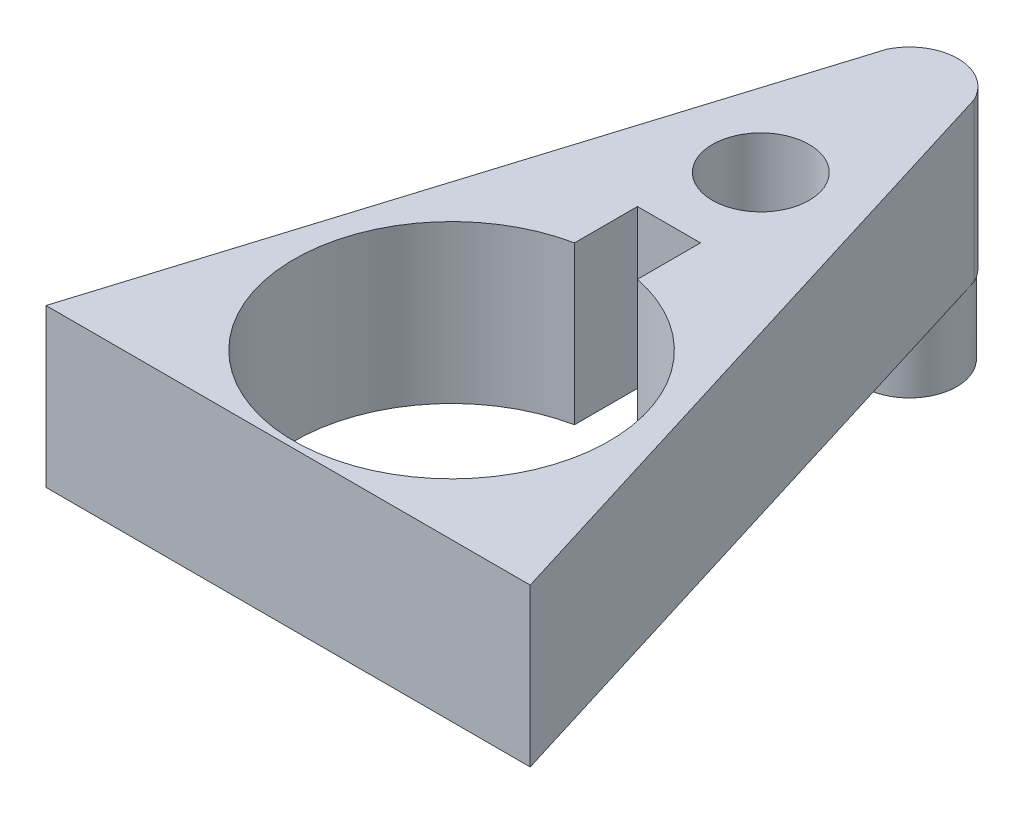
ISO-10303-21;
HEADER;
FILE_DESCRIPTION(('STEP AP214'),'2;1');
FILE_NAME('part.step','',(''),(''),'','','');
FILE_SCHEMA(('AUTOMOTIVE_DESIGN { 1 0 10303 214 1 1 1 1 }'));
ENDSEC;
DATA;
#1=APPLICATION_CONTEXT('core data for automotive mechanical design processes');
#2=APPLICATION_PROTOCOL_DEFINITION('international standard','automotive_design',2000,#1);
#3=PRODUCT_CONTEXT('',#1,'mechanical');
#4=PRODUCT('Part','Part','',(#3));
#5=PRODUCT_RELATED_PRODUCT_CATEGORY('part','',(#4));
#6=PRODUCT_DEFINITION_FORMATION('','',#4);
#7=PRODUCT_DEFINITION_CONTEXT('part definition',#1,'design');
#8=PRODUCT_DEFINITION('design','',#6,#7);
#9=PRODUCT_DEFINITION_SHAPE('','',#8);
#10=(LENGTH_UNIT() NAMED_UNIT(*) SI_UNIT(.MILLI.,.METRE.));
#11=(NAMED_UNIT(*) PLANE_ANGLE_UNIT() SI_UNIT($,.RADIAN.));
#12=(NAMED_UNIT(*) SI_UNIT($,.STERADIAN.) SOLID_ANGLE_UNIT());
#13=UNCERTAINTY_MEASURE_WITH_UNIT(LENGTH_MEASURE(1.E-05),#10,'distance_accuracy_value','');
#14=(GEOMETRIC_REPRESENTATION_CONTEXT(3) GLOBAL_UNCERTAINTY_ASSIGNED_CONTEXT((#13)) GLOBAL_UNIT_ASSIGNED_CONTEXT((#10,
#11,#12)) REPRESENTATION_CONTEXT('',''));
#15=CARTESIAN_POINT('',(0.,0.,0.));
#16=DIRECTION('',(0.,0.,1.));
#17=DIRECTION('',(1.,0.,0.));
#18=AXIS2_PLACEMENT_3D('',#15,#16,#17);
#19=CARTESIAN_POINT('',(15.3666140099526,0.,-39.4399641466912));
#20=DIRECTION('',(0.,1.,0.));
#21=DIRECTION('',(0.,0.,1.));
#22=AXIS2_PLACEMENT_3D('',#19,#20,#21);
#23=PLANE('',#22);
#24=DIRECTION('',(0.,0.,1.));
#25=VECTOR('',#24,1.);
#26=CARTESIAN_POINT('',(13.3271004224125,0.,-20.2120417496787));
#27=LINE('',#26,#25);
#28=CARTESIAN_POINT('',(13.3271004224125,0.,-24.2120417496787));
#29=VERTEX_POINT('',#28);
#30=CARTESIAN_POINT('',(13.3271004224125,0.,-20.2120417496787));
#31=VERTEX_POINT('',#30);
#32=EDGE_CURVE('E108',#29,#31,#27,.T.);
#33=ORIENTED_EDGE('',*,*,#32,.T.);
#34=CARTESIAN_POINT('',(15.3271004224125,0.,-10.414082778546));
#35=DIRECTION('',(0.,1.,0.));
#36=DIRECTION('',(0.,0.,1.));
#37=AXIS2_PLACEMENT_3D('',#34,#35,#36);
#38=CIRCLE('',#37,10.);
#39=CARTESIAN_POINT('',(17.3271004224125,0.,-20.2120417496787));
#40=VERTEX_POINT('',#39);
#41=EDGE_CURVE('E102',#31,#40,#38,.T.);
#42=ORIENTED_EDGE('',*,*,#41,.T.);
#43=DIRECTION('',(0.,0.,-1.));
#44=VECTOR('',#43,1.);
#45=CARTESIAN_POINT('',(17.3271004224125,0.,-20.2120417496787));
#46=LINE('',#45,#44);
#47=CARTESIAN_POINT('',(17.3271004224125,0.,-24.2120417496787));
#48=VERTEX_POINT('',#47);
#49=EDGE_CURVE('E111',#40,#48,#46,.T.);
#50=ORIENTED_EDGE('',*,*,#49,.T.);
#51=DIRECTION('',(-1.,0.,0.));
#52=VECTOR('',#51,1.);
#53=CARTESIAN_POINT('',(13.3271004224125,0.,-24.2120417496787));
#54=LINE('',#53,#52);
#55=EDGE_CURVE('E50',#48,#29,#54,.T.);
#56=ORIENTED_EDGE('',*,*,#55,.T.);
#57=EDGE_LOOP('',(#33,#42,#50,#56));
#58=FACE_BOUND('',#57,.T.);
#59=CARTESIAN_POINT('',(15.3666140099526,0.,-30.));
#60=DIRECTION('',(0.,1.,0.));
#61=DIRECTION('',(0.,0.,1.));
#62=AXIS2_PLACEMENT_3D('',#59,#60,#61);
#63=CIRCLE('',#62,3.07332280199052);
#64=CARTESIAN_POINT('',(15.3666140099526,0.,-26.9266771980095));
#65=VERTEX_POINT('',#64);
#66=EDGE_CURVE('E138',#65,#65,#63,.T.);
#67=ORIENTED_EDGE('',*,*,#66,.T.);
#68=EDGE_LOOP('',(#67));
#69=FACE_BOUND('',#68,.T.);
#70=DIRECTION('',(-0.29515149415526,0.,0.95545046731786));
#71=VECTOR('',#70,1.);
#72=CARTESIAN_POINT('',(0.,0.,0.));
#73=LINE('',#72,#71);
#74=CARTESIAN_POINT('',(12.5914844165515,0.,-40.7605582497616));
#75=VERTEX_POINT('',#74);
#76=CARTESIAN_POINT('',(0.,0.,0.));
#77=VERTEX_POINT('',#76);
#78=EDGE_CURVE('E142',#75,#77,#73,.T.);
#79=ORIENTED_EDGE('',*,*,#78,.F.);
#80=CARTESIAN_POINT('',(15.3666140099526,0.,-39.4399641466912));
#81=DIRECTION('',(0.,1.,0.));
#82=DIRECTION('',(0.,0.,1.));
#83=AXIS2_PLACEMENT_3D('',#80,#81,#82);
#84=CIRCLE('',#83,3.07332280199052);
#85=CARTESIAN_POINT('',(18.1417436033537,0.,-40.7605582497616));
#86=VERTEX_POINT('',#85);
#87=EDGE_CURVE('E149',#86,#75,#84,.T.);
#88=ORIENTED_EDGE('',*,*,#87,.F.);
#89=DIRECTION('',(-0.29515149415526,0.,-0.95545046731786));
#90=VECTOR('',#89,1.);
#91=CARTESIAN_POINT('',(30.7332280199051,0.,0.));
#92=LINE('',#91,#90);
#93=CARTESIAN_POINT('',(30.7332280199051,0.,0.));
#94=VERTEX_POINT('',#93);
#95=EDGE_CURVE('E160',#94,#86,#92,.T.);
#96=ORIENTED_EDGE('',*,*,#95,.F.);
#97=DIRECTION('',(1.,0.,0.));
#98=VECTOR('',#97,1.);
#99=CARTESIAN_POINT('',(0.,0.,0.));
#100=LINE('',#99,#98);
#101=EDGE_CURVE('E158',#77,#94,#100,.T.);
#102=ORIENTED_EDGE('',*,*,#101,.F.);
#103=EDGE_LOOP('',(#79,#88,#96,#102));
#104=FACE_BOUND('',#103,.T.);
#105=CARTESIAN_POINT('',(15.3666140099526,0.,-39.4399641466912));
#106=DIRECTION('',(0.,1.,0.));
#107=DIRECTION('',(0.,0.,1.));
#108=AXIS2_PLACEMENT_3D('',#105,#106,#107);
#109=CIRCLE('',#108,3.);
#110=CARTESIAN_POINT('',(15.3666140099526,0.,-36.4399641466912));
#111=VERTEX_POINT('',#110);
#112=EDGE_CURVE('E11',#111,#111,#109,.F.);
#113=ORIENTED_EDGE('',*,*,#112,.F.);
#114=EDGE_LOOP('',(#113));
#115=FACE_BOUND('',#114,.T.);
#116=ADVANCED_FACE('F35',(#58,#69,#104,#115),#23,.F.);
#117=CARTESIAN_POINT('',(15.3666140099526,10.,-39.4399641466912));
#118=DIRECTION('',(0.,1.,0.));
#119=DIRECTION('',(0.,0.,1.));
#120=AXIS2_PLACEMENT_3D('',#117,#118,#119);
#121=PLANE('',#120);
#122=CARTESIAN_POINT('',(15.3271004224125,10.,-10.414082778546));
#123=DIRECTION('',(0.,1.,0.));
#124=DIRECTION('',(0.,0.,1.));
#125=AXIS2_PLACEMENT_3D('',#122,#123,#124);
#126=CIRCLE('',#125,10.);
#127=CARTESIAN_POINT('',(13.3271004224125,10.,-20.2120417496787));
#128=VERTEX_POINT('',#127);
#129=CARTESIAN_POINT('',(17.3271004224125,10.,-20.2120417496787));
#130=VERTEX_POINT('',#129);
#131=EDGE_CURVE('E58',#128,#130,#126,.T.);
#132=ORIENTED_EDGE('',*,*,#131,.F.);
#133=DIRECTION('',(0.,0.,1.));
#134=VECTOR('',#133,1.);
#135=CARTESIAN_POINT('',(13.3271004224125,10.,-20.2120417496787));
#136=LINE('',#135,#134);
#137=CARTESIAN_POINT('',(13.3271004224125,10.,-24.2120417496787));
#138=VERTEX_POINT('',#137);
#139=EDGE_CURVE('E117',#138,#128,#136,.T.);
#140=ORIENTED_EDGE('',*,*,#139,.F.);
#141=DIRECTION('',(-1.,0.,0.));
#142=VECTOR('',#141,1.);
#143=CARTESIAN_POINT('',(13.3271004224125,10.,-24.2120417496787));
#144=LINE('',#143,#142);
#145=CARTESIAN_POINT('',(17.3271004224125,10.,-24.2120417496787));
#146=VERTEX_POINT('',#145);
#147=EDGE_CURVE('E120',#146,#138,#144,.T.);
#148=ORIENTED_EDGE('',*,*,#147,.F.);
#149=DIRECTION('',(0.,0.,-1.));
#150=VECTOR('',#149,1.);
#151=CARTESIAN_POINT('',(17.3271004224125,10.,-20.2120417496787));
#152=LINE('',#151,#150);
#153=EDGE_CURVE('E126',#130,#146,#152,.T.);
#154=ORIENTED_EDGE('',*,*,#153,.F.);
#155=EDGE_LOOP('',(#132,#140,#148,#154));
#156=FACE_BOUND('',#155,.T.);
#157=DIRECTION('',(-0.29515149415526,0.,0.95545046731786));
#158=VECTOR('',#157,1.);
#159=CARTESIAN_POINT('',(0.,10.,0.));
#160=LINE('',#159,#158);
#161=CARTESIAN_POINT('',(12.5914844165515,10.,-40.7605582497616));
#162=VERTEX_POINT('',#161);
#163=CARTESIAN_POINT('',(0.,10.,0.));
#164=VERTEX_POINT('',#163);
#165=EDGE_CURVE('E145',#162,#164,#160,.T.);
#166=ORIENTED_EDGE('',*,*,#165,.T.);
#167=DIRECTION('',(1.,0.,0.));
#168=VECTOR('',#167,1.);
#169=CARTESIAN_POINT('',(0.,10.,0.));
#170=LINE('',#169,#168);
#171=CARTESIAN_POINT('',(30.7332280199051,10.,0.));
#172=VERTEX_POINT('',#171);
#173=EDGE_CURVE('E148',#164,#172,#170,.T.);
#174=ORIENTED_EDGE('',*,*,#173,.T.);
#175=DIRECTION('',(-0.29515149415526,0.,-0.95545046731786));
#176=VECTOR('',#175,1.);
#177=CARTESIAN_POINT('',(30.7332280199051,10.,0.));
#178=LINE('',#177,#176);
#179=CARTESIAN_POINT('',(18.1417436033537,10.,-40.7605582497616));
#180=VERTEX_POINT('',#179);
#181=EDGE_CURVE('E151',#172,#180,#178,.T.);
#182=ORIENTED_EDGE('',*,*,#181,.T.);
#183=CARTESIAN_POINT('',(15.3666140099526,10.,-39.4399641466912));
#184=DIRECTION('',(0.,1.,0.));
#185=DIRECTION('',(0.,0.,1.));
#186=AXIS2_PLACEMENT_3D('',#183,#184,#185);
#187=CIRCLE('',#186,3.07332280199052);
#188=EDGE_CURVE('E153',#180,#162,#187,.T.);
#189=ORIENTED_EDGE('',*,*,#188,.T.);
#190=EDGE_LOOP('',(#166,#174,#182,#189));
#191=FACE_BOUND('',#190,.T.);
#192=CARTESIAN_POINT('',(15.3666140099526,10.,-30.));
#193=DIRECTION('',(0.,1.,0.));
#194=DIRECTION('',(0.,0.,1.));
#195=AXIS2_PLACEMENT_3D('',#192,#193,#194);
#196=CIRCLE('',#195,3.07332280199052);
#197=CARTESIAN_POINT('',(15.3666140099526,10.,-26.9266771980095));
#198=VERTEX_POINT('',#197);
#199=EDGE_CURVE('E139',#198,#198,#196,.T.);
#200=ORIENTED_EDGE('',*,*,#199,.F.);
#201=EDGE_LOOP('',(#200));
#202=FACE_BOUND('',#201,.T.);
#203=ADVANCED_FACE('F191',(#156,#191,#202),#121,.T.);
#204=CARTESIAN_POINT('',(0.,10.,0.));
#205=DIRECTION('',(0.95545046731786,0.,0.29515149415526));
#206=DIRECTION('',(0.29515149415526,0.,-0.95545046731786));
#207=AXIS2_PLACEMENT_3D('',#204,#205,#206);
#208=PLANE('',#207);
#209=ORIENTED_EDGE('',*,*,#78,.T.);
#210=DIRECTION('',(0.,-1.,0.));
#211=VECTOR('',#210,1.);
#212=CARTESIAN_POINT('',(0.,10.,0.));
#213=LINE('',#212,#211);
#214=EDGE_CURVE('E43',#164,#77,#213,.T.);
#215=ORIENTED_EDGE('',*,*,#214,.F.);
#216=ORIENTED_EDGE('',*,*,#165,.F.);
#217=DIRECTION('',(0.,-1.,0.));
#218=VECTOR('',#217,1.);
#219=CARTESIAN_POINT('',(12.5914844165515,10.,-40.7605582497616));
#220=LINE('',#219,#218);
#221=EDGE_CURVE('E155',#162,#75,#220,.T.);
#222=ORIENTED_EDGE('',*,*,#221,.T.);
#223=EDGE_LOOP('',(#209,#215,#216,#222));
#224=FACE_BOUND('',#223,.T.);
#225=ADVANCED_FACE('F37',(#224),#208,.F.);
#226=CARTESIAN_POINT('',(0.,10.,0.));
#227=DIRECTION('',(0.,0.,-1.));
#228=DIRECTION('',(-1.,0.,0.));
#229=AXIS2_PLACEMENT_3D('',#226,#227,#228);
#230=PLANE('',#229);
#231=ORIENTED_EDGE('',*,*,#101,.T.);
#232=DIRECTION('',(0.,-1.,0.));
#233=VECTOR('',#232,1.);
#234=CARTESIAN_POINT('',(30.7332280199051,10.,0.));
#235=LINE('',#234,#233);
#236=EDGE_CURVE('E168',#172,#94,#235,.T.);
#237=ORIENTED_EDGE('',*,*,#236,.F.);
#238=ORIENTED_EDGE('',*,*,#173,.F.);
#239=ORIENTED_EDGE('',*,*,#214,.T.);
#240=EDGE_LOOP('',(#231,#237,#238,#239));
#241=FACE_BOUND('',#240,.T.);
#242=ADVANCED_FACE('F173',(#241),#230,.F.);
#243=CARTESIAN_POINT('',(30.7332280199051,10.,0.));
#244=DIRECTION('',(-0.95545046731786,0.,0.29515149415526));
#245=DIRECTION('',(0.29515149415526,0.,0.95545046731786));
#246=AXIS2_PLACEMENT_3D('',#243,#244,#245);
#247=PLANE('',#246);
#248=ORIENTED_EDGE('',*,*,#95,.T.);
#249=DIRECTION('',(0.,-1.,0.));
#250=VECTOR('',#249,1.);
#251=CARTESIAN_POINT('',(18.1417436033537,10.,-40.7605582497616));
#252=LINE('',#251,#250);
#253=EDGE_CURVE('E165',#180,#86,#252,.T.);
#254=ORIENTED_EDGE('',*,*,#253,.F.);
#255=ORIENTED_EDGE('',*,*,#181,.F.);
#256=ORIENTED_EDGE('',*,*,#236,.T.);
#257=EDGE_LOOP('',(#248,#254,#255,#256));
#258=FACE_BOUND('',#257,.T.);
#259=ADVANCED_FACE('F185',(#258),#247,.F.);
#260=CARTESIAN_POINT('',(15.3666140099526,10.,-39.4399641466912));
#261=DIRECTION('',(0.,-1.,0.));
#262=DIRECTION('',(0.,0.,-1.));
#263=AXIS2_PLACEMENT_3D('',#260,#261,#262);
#264=CYLINDRICAL_SURFACE('',#263,3.07332280199052);
#265=ORIENTED_EDGE('',*,*,#87,.T.);
#266=ORIENTED_EDGE('',*,*,#221,.F.);
#267=ORIENTED_EDGE('',*,*,#188,.F.);
#268=ORIENTED_EDGE('',*,*,#253,.T.);
#269=EDGE_LOOP('',(#265,#266,#267,#268));
#270=FACE_BOUND('',#269,.T.);
#271=ADVANCED_FACE('F189',(#270),#264,.T.);
#272=CARTESIAN_POINT('',(15.3666140099526,10.,-30.));
#273=DIRECTION('',(0.,-1.,0.));
#274=DIRECTION('',(0.,0.,-1.));
#275=AXIS2_PLACEMENT_3D('',#272,#273,#274);
#276=CYLINDRICAL_SURFACE('',#275,3.07332280199052);
#277=ORIENTED_EDGE('',*,*,#199,.T.);
#278=EDGE_LOOP('',(#277));
#279=FACE_BOUND('',#278,.T.);
#280=ORIENTED_EDGE('',*,*,#66,.F.);
#281=EDGE_LOOP('',(#280));
#282=FACE_BOUND('',#281,.T.);
#283=ADVANCED_FACE('F198',(#279,#282),#276,.F.);
#284=CARTESIAN_POINT('',(15.3666140099526,-5.,-39.4399641466912));
#285=DIRECTION('',(0.,1.,0.));
#286=DIRECTION('',(0.,0.,1.));
#287=AXIS2_PLACEMENT_3D('',#284,#285,#286);
#288=CYLINDRICAL_SURFACE('',#287,3.);
#289=CARTESIAN_POINT('',(15.3666140099526,-5.,-39.4399641466912));
#290=DIRECTION('',(0.,-1.,0.));
#291=DIRECTION('',(0.,0.,-1.));
#292=AXIS2_PLACEMENT_3D('',#289,#290,#291);
#293=CIRCLE('',#292,3.);
#294=CARTESIAN_POINT('',(15.3666140099526,-5.,-42.4399641466912));
#295=VERTEX_POINT('',#294);
#296=EDGE_CURVE('E132',#295,#295,#293,.T.);
#297=ORIENTED_EDGE('',*,*,#296,.F.);
#298=EDGE_LOOP('',(#297));
#299=FACE_BOUND('',#298,.T.);
#300=ORIENTED_EDGE('',*,*,#112,.T.);
#301=EDGE_LOOP('',(#300));
#302=FACE_BOUND('',#301,.T.);
#303=ADVANCED_FACE('F201',(#299,#302),#288,.T.);
#304=CARTESIAN_POINT('',(15.3666140099526,-5.,-39.4399641466912));
#305=DIRECTION('',(0.,-1.,0.));
#306=DIRECTION('',(0.,0.,-1.));
#307=AXIS2_PLACEMENT_3D('',#304,#305,#306);
#308=PLANE('',#307);
#309=ORIENTED_EDGE('',*,*,#296,.T.);
#310=EDGE_LOOP('',(#309));
#311=FACE_BOUND('',#310,.T.);
#312=ADVANCED_FACE('F235',(#311),#308,.T.);
#313=CARTESIAN_POINT('',(15.3271004224125,0.,-10.414082778546));
#314=DIRECTION('',(0.,1.,0.));
#315=DIRECTION('',(0.,0.,1.));
#316=AXIS2_PLACEMENT_3D('',#313,#314,#315);
#317=CYLINDRICAL_SURFACE('',#316,10.);
#318=ORIENTED_EDGE('',*,*,#131,.T.);
#319=DIRECTION('',(0.,1.,0.));
#320=VECTOR('',#319,1.);
#321=CARTESIAN_POINT('',(17.3271004224125,0.,-20.2120417496787));
#322=LINE('',#321,#320);
#323=EDGE_CURVE('E98',#40,#130,#322,.T.);
#324=ORIENTED_EDGE('',*,*,#323,.F.);
#325=ORIENTED_EDGE('',*,*,#41,.F.);
#326=DIRECTION('',(0.,1.,0.));
#327=VECTOR('',#326,1.);
#328=CARTESIAN_POINT('',(13.3271004224125,0.,-20.2120417496787));
#329=LINE('',#328,#327);
#330=EDGE_CURVE('E130',#31,#128,#329,.T.);
#331=ORIENTED_EDGE('',*,*,#330,.T.);
#332=EDGE_LOOP('',(#318,#324,#325,#331));
#333=FACE_BOUND('',#332,.T.);
#334=ADVANCED_FACE('F100',(#333),#317,.F.);
#335=CARTESIAN_POINT('',(13.3271004224125,0.,-20.2120417496787));
#336=DIRECTION('',(-1.,0.,0.));
#337=DIRECTION('',(0.,0.,1.));
#338=AXIS2_PLACEMENT_3D('',#335,#336,#337);
#339=PLANE('',#338);
#340=ORIENTED_EDGE('',*,*,#139,.T.);
#341=ORIENTED_EDGE('',*,*,#330,.F.);
#342=ORIENTED_EDGE('',*,*,#32,.F.);
#343=DIRECTION('',(0.,1.,0.));
#344=VECTOR('',#343,1.);
#345=CARTESIAN_POINT('',(13.3271004224125,0.,-24.2120417496787));
#346=LINE('',#345,#344);
#347=EDGE_CURVE('E133',#29,#138,#346,.T.);
#348=ORIENTED_EDGE('',*,*,#347,.T.);
#349=EDGE_LOOP('',(#340,#341,#342,#348));
#350=FACE_BOUND('',#349,.T.);
#351=ADVANCED_FACE('F234',(#350),#339,.F.);
#352=CARTESIAN_POINT('',(13.3271004224125,0.,-24.2120417496787));
#353=DIRECTION('',(0.,0.,-1.));
#354=DIRECTION('',(-1.,0.,0.));
#355=AXIS2_PLACEMENT_3D('',#352,#353,#354);
#356=PLANE('',#355);
#357=ORIENTED_EDGE('',*,*,#147,.T.);
#358=ORIENTED_EDGE('',*,*,#347,.F.);
#359=ORIENTED_EDGE('',*,*,#55,.F.);
#360=DIRECTION('',(0.,1.,0.));
#361=VECTOR('',#360,1.);
#362=CARTESIAN_POINT('',(17.3271004224125,0.,-24.2120417496787));
#363=LINE('',#362,#361);
#364=EDGE_CURVE('E107',#48,#146,#363,.T.);
#365=ORIENTED_EDGE('',*,*,#364,.T.);
#366=EDGE_LOOP('',(#357,#358,#359,#365));
#367=FACE_BOUND('',#366,.T.);
#368=ADVANCED_FACE('F246',(#367),#356,.F.);
#369=CARTESIAN_POINT('',(17.3271004224125,0.,-20.2120417496787));
#370=DIRECTION('',(1.,0.,0.));
#371=DIRECTION('',(0.,0.,-1.));
#372=AXIS2_PLACEMENT_3D('',#369,#370,#371);
#373=PLANE('',#372);
#374=ORIENTED_EDGE('',*,*,#153,.T.);
#375=ORIENTED_EDGE('',*,*,#364,.F.);
#376=ORIENTED_EDGE('',*,*,#49,.F.);
#377=ORIENTED_EDGE('',*,*,#323,.T.);
#378=EDGE_LOOP('',(#374,#375,#376,#377));
#379=FACE_BOUND('',#378,.T.);
#380=ADVANCED_FACE('F112',(#379),#373,.F.);
#381=CLOSED_SHELL('',(#116,#203,#225,#242,#259,#271,#283,#303,#312,#334,#351,#368,#380));
#382=MANIFOLD_SOLID_BREP('B2',#381);
#383=ADVANCED_BREP_SHAPE_REPRESENTATION('',(#18,#382),#14);
#384=SHAPE_DEFINITION_REPRESENTATION(#9,#383);
ENDSEC;
END-ISO-10303-21;
